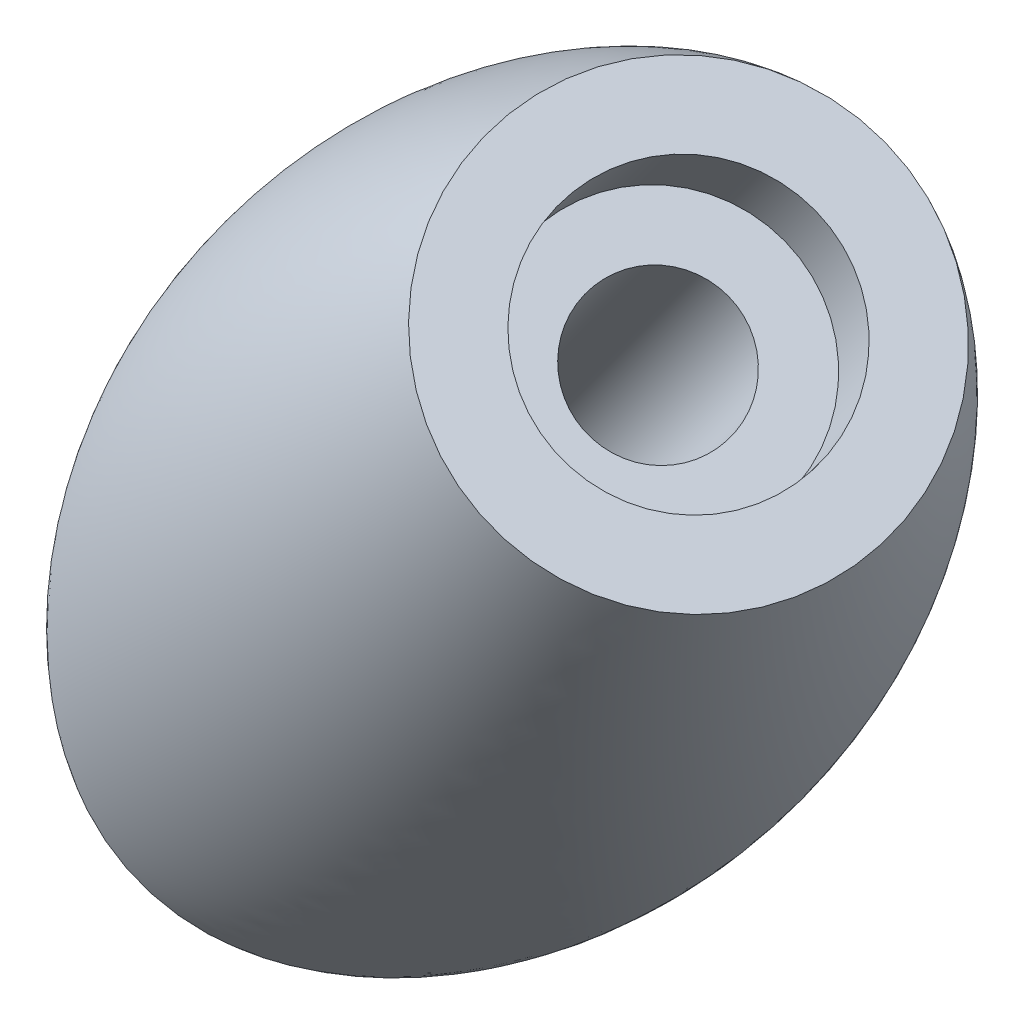
ISO-10303-21;
HEADER;
FILE_DESCRIPTION(('STEP AP214'),'2;1');
FILE_NAME('part.step','',(''),(''),'','','');
FILE_SCHEMA(('AUTOMOTIVE_DESIGN { 1 0 10303 214 1 1 1 1 }'));
ENDSEC;
DATA;
#1=APPLICATION_CONTEXT('core data for automotive mechanical design processes');
#2=APPLICATION_PROTOCOL_DEFINITION('international standard','automotive_design',2000,#1);
#3=PRODUCT_CONTEXT('',#1,'mechanical');
#4=PRODUCT('Part','Part','',(#3));
#5=PRODUCT_RELATED_PRODUCT_CATEGORY('part','',(#4));
#6=PRODUCT_DEFINITION_FORMATION('','',#4);
#7=PRODUCT_DEFINITION_CONTEXT('part definition',#1,'design');
#8=PRODUCT_DEFINITION('design','',#6,#7);
#9=PRODUCT_DEFINITION_SHAPE('','',#8);
#10=(LENGTH_UNIT() NAMED_UNIT(*) SI_UNIT(.MILLI.,.METRE.));
#11=(NAMED_UNIT(*) PLANE_ANGLE_UNIT() SI_UNIT($,.RADIAN.));
#12=(NAMED_UNIT(*) SI_UNIT($,.STERADIAN.) SOLID_ANGLE_UNIT());
#13=UNCERTAINTY_MEASURE_WITH_UNIT(LENGTH_MEASURE(1.E-05),#10,'distance_accuracy_value','');
#14=(GEOMETRIC_REPRESENTATION_CONTEXT(3) GLOBAL_UNCERTAINTY_ASSIGNED_CONTEXT((#13)) GLOBAL_UNIT_ASSIGNED_CONTEXT((#10,
#11,#12)) REPRESENTATION_CONTEXT('',''));
#15=CARTESIAN_POINT('',(0.,0.,0.));
#16=DIRECTION('',(0.,0.,1.));
#17=DIRECTION('',(1.,0.,0.));
#18=AXIS2_PLACEMENT_3D('',#15,#16,#17);
#19=CARTESIAN_POINT('',(-17.18661123506,-1.401400444374,54.87625895502));
#20=CARTESIAN_POINT('',(-17.31187724273,-1.484652197579,54.82132174948));
#21=CARTESIAN_POINT('',(-23.82055685369,-5.833603400682,51.96017198126));
#22=CARTESIAN_POINT('',(-35.14284534165,-15.80656928184,46.29280965035));
#23=CARTESIAN_POINT('',(-43.38533048729,-28.44464568726,40.62538170345));
#24=CARTESIAN_POINT('',(-46.75387524003,-35.51091086095,37.76416631924));
#25=CARTESIAN_POINT('',(-46.81833781416,-35.64700329285,37.70916349771));
#26=B_SPLINE_CURVE_WITH_KNOTS('',3,(#19,#20,#21,#22,#23,#24,#25),.UNSPECIFIED.,.F.,.F.,(4,1,1,1,
4),(0.,0.009600436894524,0.499994266707,0.9903880965195,1.),.UNSPECIFIED.);
#27=CARTESIAN_POINT('',(-42.80263963811,-41.48281690256,37.03230819348));
#28=DIRECTION('',(0.611842920803622,0.707106781184164,0.354468955292087));
#29=AXIS1_PLACEMENT('',#27,#28);
#30=SURFACE_OF_REVOLUTION('',#26,#29);
#31=CARTESIAN_POINT('',(-41.3495127012087,-39.803438297256,37.8741719622945));
#32=DIRECTION('',(0.611842920803622,0.707106781184164,0.354468955292087));
#33=DIRECTION('',(-0.756209115171996,0.654330019279864,0.));
#34=AXIS2_PLACEMENT_3D('',#31,#32,#33);
#35=CIRCLE('',#34,6.97500000000405);
#36=CARTESIAN_POINT('',(-46.6240712795364,-35.2394864127763,37.8741719622945));
#37=VERTEX_POINT('',#36);
#38=EDGE_CURVE('E45',#37,#37,#35,.T.);
#39=ORIENTED_EDGE('',*,*,#38,.T.);
#40=EDGE_LOOP('',(#39));
#41=FACE_BOUND('',#40,.T.);
#42=CARTESIAN_POINT('',(-12.2869739630241,-6.21586619099373,54.7114473386759));
#43=DIRECTION('',(0.611842920803622,0.707106781184164,0.354468955292087));
#44=DIRECTION('',(-0.756209115171996,0.654330019279864,0.));
#45=AXIS2_PLACEMENT_3D('',#42,#43,#44);
#46=CIRCLE('',#45,6.97500000007032);
#47=CARTESIAN_POINT('',(-17.561532541402,-1.65191430647068,54.7114473386759));
#48=VERTEX_POINT('',#47);
#49=EDGE_CURVE('E19',#48,#48,#46,.T.);
#50=ORIENTED_EDGE('',*,*,#49,.F.);
#51=EDGE_LOOP('',(#50));
#52=FACE_BOUND('',#51,.T.);
#53=ADVANCED_FACE('F15',(#41,#52),#30,.F.);
#54=CARTESIAN_POINT('',(-19.45709885581,-3.416229699845,61.50286919174));
#55=DIRECTION('',(0.611842920803659,0.707106781186696,0.354468955286972));
#56=DIRECTION('',(0.756209115173136,-0.654330019278546,0.));
#57=AXIS2_PLACEMENT_3D('',#54,#55,#56);
#58=PLANE('',#57);
#59=CARTESIAN_POINT('',(-12.2869739630273,-6.21586619099735,54.7114473386741));
#60=DIRECTION('',(0.611842920803621,0.707106781184165,0.354468955292087));
#61=DIRECTION('',(-0.756209115171997,0.654330019279863,0.));
#62=AXIS2_PLACEMENT_3D('',#59,#60,#61);
#63=CIRCLE('',#62,4.49999999992317);
#64=CARTESIAN_POINT('',(-15.6899149812431,-3.27138110428824,54.7114473386741));
#65=VERTEX_POINT('',#64);
#66=EDGE_CURVE('E43',#65,#65,#63,.T.);
#67=ORIENTED_EDGE('',*,*,#66,.F.);
#68=EDGE_LOOP('',(#67));
#69=FACE_BOUND('',#68,.T.);
#70=ORIENTED_EDGE('',*,*,#49,.T.);
#71=EDGE_LOOP('',(#70));
#72=FACE_BOUND('',#71,.T.);
#73=ADVANCED_FACE('F52',(#69,#72),#58,.T.);
#74=CARTESIAN_POINT('',(-48.51963759398,-37.00380180621,44.66559381561));
#75=DIRECTION('',(0.611842920804052,0.707106781186521,0.354468955286643));
#76=DIRECTION('',(0.756209115172848,-0.65433001927888,0.));
#77=AXIS2_PLACEMENT_3D('',#74,#75,#76);
#78=PLANE('',#77);
#79=CARTESIAN_POINT('',(-41.3495127012015,-39.8034382972478,37.8741719622986));
#80=DIRECTION('',(0.611842920803622,0.707106781184164,0.354468955292087));
#81=DIRECTION('',(-0.756209115171996,0.654330019279864,0.));
#82=AXIS2_PLACEMENT_3D('',#79,#80,#81);
#83=CIRCLE('',#82,4.4999999999976);
#84=CARTESIAN_POINT('',(-44.7524537194737,-36.8589532104899,37.8741719622986));
#85=VERTEX_POINT('',#84);
#86=EDGE_CURVE('E40',#85,#85,#83,.F.);
#87=ORIENTED_EDGE('',*,*,#86,.F.);
#88=EDGE_LOOP('',(#87));
#89=FACE_BOUND('',#88,.T.);
#90=ORIENTED_EDGE('',*,*,#38,.F.);
#91=EDGE_LOOP('',(#90));
#92=FACE_BOUND('',#91,.T.);
#93=ADVANCED_FACE('F60',(#89,#92),#78,.F.);
#94=CARTESIAN_POINT('',(-14.7955299383196,-9.11500399384958,53.2581246219779));
#95=DIRECTION('',(0.611842920803621,0.707106781184165,0.354468955292087));
#96=DIRECTION('',(-0.756209115171997,0.654330019279863,0.));
#97=AXIS2_PLACEMENT_3D('',#94,#95,#96);
#98=CYLINDRICAL_SURFACE('',#97,4.49999999992317);
#99=CARTESIAN_POINT('',(-14.7955299383196,-9.11500399384957,53.2581246219779));
#100=DIRECTION('',(0.611842920803621,0.707106781184165,0.354468955292087));
#101=DIRECTION('',(-0.756209115171997,0.654330019279863,0.));
#102=AXIS2_PLACEMENT_3D('',#99,#100,#101);
#103=CIRCLE('',#102,4.49999999992317);
#104=CARTESIAN_POINT('',(-18.1984709565355,-6.17051890714046,53.2581246219779));
#105=VERTEX_POINT('',#104);
#106=EDGE_CURVE('E37',#105,#105,#103,.T.);
#107=ORIENTED_EDGE('',*,*,#106,.F.);
#108=EDGE_LOOP('',(#107));
#109=FACE_BOUND('',#108,.T.);
#110=ORIENTED_EDGE('',*,*,#66,.T.);
#111=EDGE_LOOP('',(#110));
#112=FACE_BOUND('',#111,.T.);
#113=ADVANCED_FACE('F76',(#109,#112),#98,.F.);
#114=CARTESIAN_POINT('',(-41.3495127012015,-39.8034382972478,37.8741719622986));
#115=DIRECTION('',(0.611842920803622,0.707106781184164,0.354468955292087));
#116=DIRECTION('',(-0.756209115171996,0.654330019279864,0.));
#117=AXIS2_PLACEMENT_3D('',#114,#115,#116);
#118=CYLINDRICAL_SURFACE('',#117,4.4999999999976);
#119=CARTESIAN_POINT('',(-38.8409567259043,-36.90430049439,39.3274946789976));
#120=DIRECTION('',(0.611842920803622,0.707106781184164,0.354468955292087));
#121=DIRECTION('',(-0.756209115171996,0.654330019279864,0.));
#122=AXIS2_PLACEMENT_3D('',#119,#120,#121);
#123=CIRCLE('',#122,4.4999999999976);
#124=CARTESIAN_POINT('',(-42.2438977441765,-33.9598154076321,39.3274946789976));
#125=VERTEX_POINT('',#124);
#126=EDGE_CURVE('E28',#125,#125,#123,.T.);
#127=ORIENTED_EDGE('',*,*,#126,.T.);
#128=EDGE_LOOP('',(#127));
#129=FACE_BOUND('',#128,.T.);
#130=ORIENTED_EDGE('',*,*,#86,.T.);
#131=EDGE_LOOP('',(#130));
#132=FACE_BOUND('',#131,.T.);
#133=ADVANCED_FACE('F74',(#129,#132),#118,.F.);
#134=CARTESIAN_POINT('',(-19.42178679527,-7.309214314484,57.64117807951));
#135=DIRECTION('',(0.611842920803567,0.707106781186673,0.354468955287177));
#136=DIRECTION('',(0.756209115173174,-0.654330019278503,0.));
#137=AXIS2_PLACEMENT_3D('',#134,#135,#136);
#138=PLANE('',#137);
#139=CARTESIAN_POINT('',(-14.7955299383258,-9.11500399385658,53.2581246219745));
#140=DIRECTION('',(0.61184292080362,0.707106781184165,0.354468955292088));
#141=DIRECTION('',(-0.756209115171997,0.654330019279862,0.));
#142=AXIS2_PLACEMENT_3D('',#139,#140,#141);
#143=CIRCLE('',#142,2.49999999995887);
#144=CARTESIAN_POINT('',(-16.6860527262247,-7.47917894568384,53.2581246219745));
#145=VERTEX_POINT('',#144);
#146=EDGE_CURVE('E23',#145,#145,#143,.T.);
#147=ORIENTED_EDGE('',*,*,#146,.F.);
#148=EDGE_LOOP('',(#147));
#149=FACE_BOUND('',#148,.T.);
#150=ORIENTED_EDGE('',*,*,#106,.T.);
#151=EDGE_LOOP('',(#150));
#152=FACE_BOUND('',#151,.T.);
#153=ADVANCED_FACE('F71',(#149,#152),#138,.T.);
#154=CARTESIAN_POINT('',(-43.46721358286,-35.09851081512,43.71054813674));
#155=DIRECTION('',(0.611842920803883,0.707106781186577,0.354468955286823));
#156=DIRECTION('',(0.756209115172963,-0.654330019278746,0.));
#157=AXIS2_PLACEMENT_3D('',#154,#155,#156);
#158=PLANE('',#157);
#159=CARTESIAN_POINT('',(-38.8409567259074,-36.9043004943935,39.3274946789958));
#160=DIRECTION('',(0.61184292080362,0.707106781184165,0.354468955292088));
#161=DIRECTION('',(-0.756209115171997,0.654330019279862,0.));
#162=AXIS2_PLACEMENT_3D('',#159,#160,#161);
#163=CIRCLE('',#162,2.49999999995887);
#164=CARTESIAN_POINT('',(-40.7314795138063,-35.2684754462208,39.3274946789958));
#165=VERTEX_POINT('',#164);
#166=EDGE_CURVE('E10',#165,#165,#163,.F.);
#167=ORIENTED_EDGE('',*,*,#166,.F.);
#168=EDGE_LOOP('',(#167));
#169=FACE_BOUND('',#168,.T.);
#170=ORIENTED_EDGE('',*,*,#126,.F.);
#171=EDGE_LOOP('',(#170));
#172=FACE_BOUND('',#171,.T.);
#173=ADVANCED_FACE('F17',(#169,#172),#158,.F.);
#174=CARTESIAN_POINT('',(-38.8409567259074,-36.9043004943935,39.3274946789958));
#175=DIRECTION('',(0.61184292080362,0.707106781184165,0.354468955292088));
#176=DIRECTION('',(-0.756209115171997,0.654330019279862,0.));
#177=AXIS2_PLACEMENT_3D('',#174,#175,#176);
#178=CYLINDRICAL_SURFACE('',#177,2.49999999995887);
#179=ORIENTED_EDGE('',*,*,#146,.T.);
#180=EDGE_LOOP('',(#179));
#181=FACE_BOUND('',#180,.T.);
#182=ORIENTED_EDGE('',*,*,#166,.T.);
#183=EDGE_LOOP('',(#182));
#184=FACE_BOUND('',#183,.T.);
#185=ADVANCED_FACE('F64',(#181,#184),#178,.F.);
#186=CLOSED_SHELL('',(#53,#73,#93,#113,#133,#153,#173,#185));
#187=MANIFOLD_SOLID_BREP('B1',#186);
#188=ADVANCED_BREP_SHAPE_REPRESENTATION('',(#18,#187),#14);
#189=SHAPE_DEFINITION_REPRESENTATION(#9,#188);
ENDSEC;
END-ISO-10303-21;
